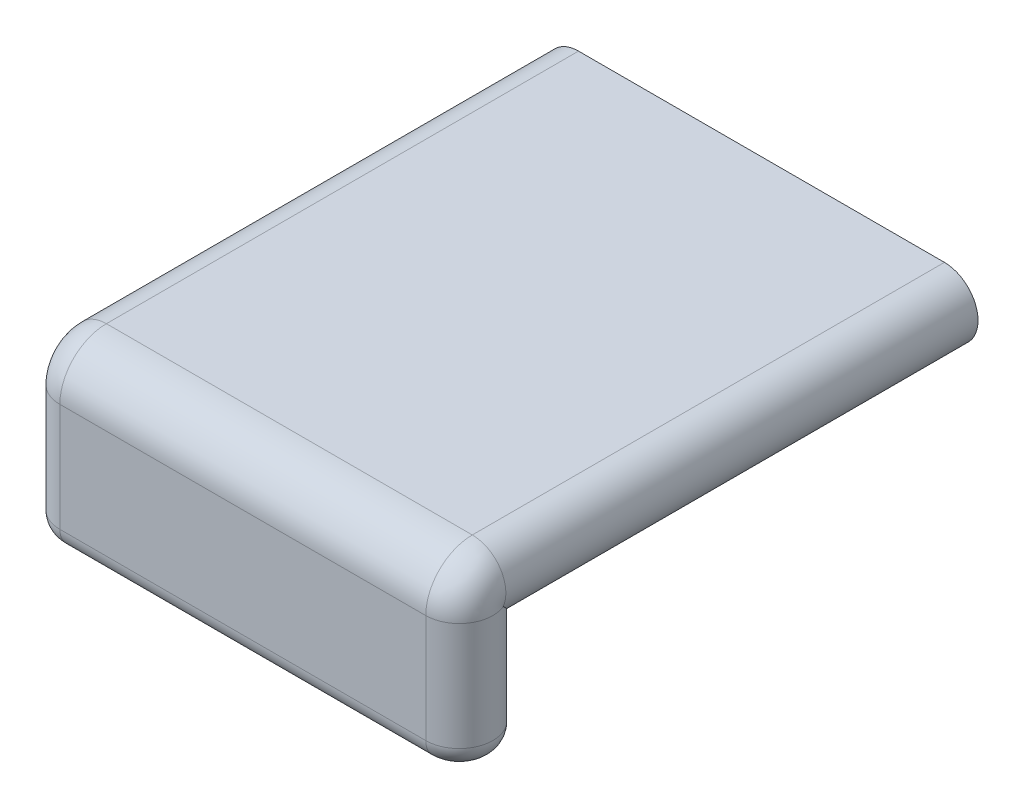
ISO-10303-21;
HEADER;
FILE_DESCRIPTION(('STEP AP214'),'2;1');
FILE_NAME('part.step','',(''),(''),'','','');
FILE_SCHEMA(('AUTOMOTIVE_DESIGN { 1 0 10303 214 1 1 1 1 }'));
ENDSEC;
DATA;
#1=APPLICATION_CONTEXT('core data for automotive mechanical design processes');
#2=APPLICATION_PROTOCOL_DEFINITION('international standard','automotive_design',2000,#1);
#3=PRODUCT_CONTEXT('',#1,'mechanical');
#4=PRODUCT('Part','Part','',(#3));
#5=PRODUCT_RELATED_PRODUCT_CATEGORY('part','',(#4));
#6=PRODUCT_DEFINITION_FORMATION('','',#4);
#7=PRODUCT_DEFINITION_CONTEXT('part definition',#1,'design');
#8=PRODUCT_DEFINITION('design','',#6,#7);
#9=PRODUCT_DEFINITION_SHAPE('','',#8);
#10=(LENGTH_UNIT() NAMED_UNIT(*) SI_UNIT(.MILLI.,.METRE.));
#11=(NAMED_UNIT(*) PLANE_ANGLE_UNIT() SI_UNIT($,.RADIAN.));
#12=(NAMED_UNIT(*) SI_UNIT($,.STERADIAN.) SOLID_ANGLE_UNIT());
#13=UNCERTAINTY_MEASURE_WITH_UNIT(LENGTH_MEASURE(1.E-05),#10,'distance_accuracy_value','');
#14=(GEOMETRIC_REPRESENTATION_CONTEXT(3) GLOBAL_UNCERTAINTY_ASSIGNED_CONTEXT((#13)) GLOBAL_UNIT_ASSIGNED_CONTEXT((#10,
#11,#12)) REPRESENTATION_CONTEXT('',''));
#15=CARTESIAN_POINT('',(0.,0.,0.));
#16=DIRECTION('',(0.,0.,1.));
#17=DIRECTION('',(1.,0.,0.));
#18=AXIS2_PLACEMENT_3D('',#15,#16,#17);
#19=CARTESIAN_POINT('',(-4.225,0.,10.9032));
#20=DIRECTION('',(0.,0.,-1.));
#21=DIRECTION('',(-1.,0.,0.));
#22=AXIS2_PLACEMENT_3D('',#19,#20,#21);
#23=CYLINDRICAL_SURFACE('',#22,0.775);
#24=DIRECTION('',(0.,0.,-1.));
#25=VECTOR('',#24,1.);
#26=CARTESIAN_POINT('',(-4.225,-0.775000000000014,10.9032));
#27=LINE('',#26,#25);
#28=CARTESIAN_POINT('',(-4.22499999999997,-0.775000000000014,10.4282));
#29=VERTEX_POINT('',#28);
#30=CARTESIAN_POINT('',(-4.225,-0.775,0.));
#31=VERTEX_POINT('',#30);
#32=EDGE_CURVE('E217',#29,#31,#27,.T.);
#33=ORIENTED_EDGE('',*,*,#32,.F.);
#34=CARTESIAN_POINT('',(-4.225,0.,11.2032));
#35=DIRECTION('',(0.,0.707106781186547,-0.707106781186547));
#36=DIRECTION('',(0.,-0.707106781186547,-0.707106781186547));
#37=AXIS2_PLACEMENT_3D('',#34,#35,#36);
#38=ELLIPSE('',#37,1.09601551083915,0.775);
#39=CARTESIAN_POINT('',(-4.9395802963978,-0.299999999999993,10.9032));
#40=VERTEX_POINT('',#39);
#41=EDGE_CURVE('E575',#29,#40,#38,.T.);
#42=ORIENTED_EDGE('',*,*,#41,.T.);
#43=CARTESIAN_POINT('',(-4.225,0.,10.9032));
#44=DIRECTION('',(0.,0.,1.));
#45=DIRECTION('',(1.,0.,0.));
#46=AXIS2_PLACEMENT_3D('',#43,#44,#45);
#47=CIRCLE('',#46,0.775);
#48=CARTESIAN_POINT('',(-4.22499999999997,0.774999999999987,10.9032));
#49=VERTEX_POINT('',#48);
#50=EDGE_CURVE('E198',#49,#40,#47,.T.);
#51=ORIENTED_EDGE('',*,*,#50,.F.);
#52=DIRECTION('',(0.,0.,-1.));
#53=VECTOR('',#52,1.);
#54=CARTESIAN_POINT('',(-4.22499999999997,0.774999999999987,10.9032));
#55=LINE('',#54,#53);
#56=CARTESIAN_POINT('',(-4.22499999999997,0.775,-1.11022302462516E-13));
#57=VERTEX_POINT('',#56);
#58=EDGE_CURVE('E193',#49,#57,#55,.T.);
#59=ORIENTED_EDGE('',*,*,#58,.T.);
#60=CARTESIAN_POINT('',(-4.225,0.,0.));
#61=DIRECTION('',(0.,0.,1.));
#62=DIRECTION('',(1.,0.,0.));
#63=AXIS2_PLACEMENT_3D('',#60,#61,#62);
#64=CIRCLE('',#63,0.775);
#65=EDGE_CURVE('E207',#57,#31,#64,.T.);
#66=ORIENTED_EDGE('',*,*,#65,.T.);
#67=EDGE_LOOP('',(#33,#42,#51,#59,#66));
#68=FACE_BOUND('',#67,.T.);
#69=ADVANCED_FACE('F34',(#68),#23,.T.);
#70=CARTESIAN_POINT('',(-4.225,-0.775000000000014,10.9032));
#71=DIRECTION('',(0.,1.,0.));
#72=DIRECTION('',(0.,0.,1.));
#73=AXIS2_PLACEMENT_3D('',#70,#71,#72);
#74=PLANE('',#73);
#75=DIRECTION('',(0.,0.,-1.));
#76=VECTOR('',#75,1.);
#77=CARTESIAN_POINT('',(4.225,-0.775000000000014,10.9032));
#78=LINE('',#77,#76);
#79=CARTESIAN_POINT('',(4.22500000000003,-0.775000000000014,10.4282));
#80=VERTEX_POINT('',#79);
#81=CARTESIAN_POINT('',(4.225,-0.775,1.11022302462516E-13));
#82=VERTEX_POINT('',#81);
#83=EDGE_CURVE('E192',#80,#82,#78,.T.);
#84=ORIENTED_EDGE('',*,*,#83,.F.);
#85=DIRECTION('',(-1.,0.,0.));
#86=VECTOR('',#85,1.);
#87=CARTESIAN_POINT('',(-4.22499999999997,-0.775000000000014,10.4282));
#88=LINE('',#87,#86);
#89=EDGE_CURVE('E369',#80,#29,#88,.T.);
#90=ORIENTED_EDGE('',*,*,#89,.T.);
#91=ORIENTED_EDGE('',*,*,#32,.T.);
#92=DIRECTION('',(1.,0.,0.));
#93=VECTOR('',#92,1.);
#94=CARTESIAN_POINT('',(-4.225,-0.775,0.));
#95=LINE('',#94,#93);
#96=EDGE_CURVE('E210',#31,#82,#95,.T.);
#97=ORIENTED_EDGE('',*,*,#96,.T.);
#98=EDGE_LOOP('',(#84,#90,#91,#97));
#99=FACE_BOUND('',#98,.T.);
#100=ADVANCED_FACE('F322',(#99),#74,.F.);
#101=CARTESIAN_POINT('',(4.225,0.,10.9032000000002));
#102=DIRECTION('',(0.,0.,-1.));
#103=DIRECTION('',(-1.,0.,0.));
#104=AXIS2_PLACEMENT_3D('',#101,#102,#103);
#105=CYLINDRICAL_SURFACE('',#104,0.775);
#106=CARTESIAN_POINT('',(4.225,0.,10.9032000000002));
#107=DIRECTION('',(0.,0.,1.));
#108=DIRECTION('',(1.,0.,0.));
#109=AXIS2_PLACEMENT_3D('',#106,#107,#108);
#110=CIRCLE('',#109,0.775);
#111=CARTESIAN_POINT('',(4.93958029639785,-0.300000000000014,10.9032));
#112=VERTEX_POINT('',#111);
#113=CARTESIAN_POINT('',(4.22500000000003,0.774999999999987,10.9032));
#114=VERTEX_POINT('',#113);
#115=EDGE_CURVE('E162',#112,#114,#110,.T.);
#116=ORIENTED_EDGE('',*,*,#115,.F.);
#117=CARTESIAN_POINT('',(4.225,0.,11.2032000000002));
#118=DIRECTION('',(0.,0.707106781186547,-0.707106781186547));
#119=DIRECTION('',(0.,-0.707106781186547,-0.707106781186547));
#120=AXIS2_PLACEMENT_3D('',#117,#118,#119);
#121=ELLIPSE('',#120,1.09601551083915,0.775);
#122=EDGE_CURVE('E374',#112,#80,#121,.T.);
#123=ORIENTED_EDGE('',*,*,#122,.T.);
#124=ORIENTED_EDGE('',*,*,#83,.T.);
#125=CARTESIAN_POINT('',(4.225,0.,0.));
#126=DIRECTION('',(0.,0.,1.));
#127=DIRECTION('',(1.,0.,0.));
#128=AXIS2_PLACEMENT_3D('',#125,#126,#127);
#129=CIRCLE('',#128,0.775);
#130=CARTESIAN_POINT('',(4.22500000000003,0.775,0.));
#131=VERTEX_POINT('',#130);
#132=EDGE_CURVE('E189',#82,#131,#129,.T.);
#133=ORIENTED_EDGE('',*,*,#132,.T.);
#134=DIRECTION('',(0.,0.,-1.));
#135=VECTOR('',#134,1.);
#136=CARTESIAN_POINT('',(4.22500000000003,0.774999999999987,10.9032));
#137=LINE('',#136,#135);
#138=EDGE_CURVE('E186',#114,#131,#137,.T.);
#139=ORIENTED_EDGE('',*,*,#138,.F.);
#140=EDGE_LOOP('',(#116,#123,#124,#133,#139));
#141=FACE_BOUND('',#140,.T.);
#142=ADVANCED_FACE('F187',(#141),#105,.T.);
#143=CARTESIAN_POINT('',(-4.22499999999997,0.774999999999987,10.9032));
#144=DIRECTION('',(0.,-1.,0.));
#145=DIRECTION('',(0.,0.,-1.));
#146=AXIS2_PLACEMENT_3D('',#143,#144,#145);
#147=PLANE('',#146);
#148=DIRECTION('',(-1.,0.,0.));
#149=VECTOR('',#148,1.);
#150=CARTESIAN_POINT('',(-4.22499999999997,0.775,-1.11022302462516E-13));
#151=LINE('',#150,#149);
#152=EDGE_CURVE('E201',#131,#57,#151,.T.);
#153=ORIENTED_EDGE('',*,*,#152,.T.);
#154=ORIENTED_EDGE('',*,*,#58,.F.);
#155=DIRECTION('',(-1.,0.,0.));
#156=VECTOR('',#155,1.);
#157=CARTESIAN_POINT('',(-4.22499999999997,0.774999999999987,10.9032));
#158=LINE('',#157,#156);
#159=EDGE_CURVE('E178',#114,#49,#158,.T.);
#160=ORIENTED_EDGE('',*,*,#159,.F.);
#161=ORIENTED_EDGE('',*,*,#138,.T.);
#162=EDGE_LOOP('',(#153,#154,#160,#161));
#163=FACE_BOUND('',#162,.T.);
#164=ADVANCED_FACE('F195',(#163),#147,.F.);
#165=CARTESIAN_POINT('',(-4.225,0.,0.));
#166=DIRECTION('',(0.,0.,1.));
#167=DIRECTION('',(1.,0.,0.));
#168=AXIS2_PLACEMENT_3D('',#165,#166,#167);
#169=PLANE('',#168);
#170=DIRECTION('',(0.,-1.,0.));
#171=VECTOR('',#170,1.);
#172=CARTESIAN_POINT('',(-4.49999999999997,-0.25,0.));
#173=LINE('',#172,#171);
#174=CARTESIAN_POINT('',(-4.5,0.0499999999999997,0.));
#175=VERTEX_POINT('',#174);
#176=CARTESIAN_POINT('',(-4.5,-0.0500000000000014,0.));
#177=VERTEX_POINT('',#176);
#178=EDGE_CURVE('E390',#175,#177,#173,.T.);
#179=ORIENTED_EDGE('',*,*,#178,.T.);
#180=CARTESIAN_POINT('',(-4.3,-0.0499999999999997,0.));
#181=DIRECTION('',(0.,0.,1.));
#182=DIRECTION('',(1.,0.,0.));
#183=AXIS2_PLACEMENT_3D('',#180,#181,#182);
#184=CIRCLE('',#183,0.2);
#185=CARTESIAN_POINT('',(-4.29999999999997,-0.25,0.));
#186=VERTEX_POINT('',#185);
#187=EDGE_CURVE('E257',#177,#186,#184,.T.);
#188=ORIENTED_EDGE('',*,*,#187,.T.);
#189=DIRECTION('',(1.,0.,0.));
#190=VECTOR('',#189,1.);
#191=CARTESIAN_POINT('',(-4.49999999999997,-0.25,0.));
#192=LINE('',#191,#190);
#193=CARTESIAN_POINT('',(4.30000000000003,-0.25,0.));
#194=VERTEX_POINT('',#193);
#195=EDGE_CURVE('E211',#186,#194,#192,.T.);
#196=ORIENTED_EDGE('',*,*,#195,.T.);
#197=CARTESIAN_POINT('',(4.3,-0.0499999999999997,0.));
#198=DIRECTION('',(0.,0.,1.));
#199=DIRECTION('',(1.,0.,0.));
#200=AXIS2_PLACEMENT_3D('',#197,#198,#199);
#201=CIRCLE('',#200,0.2);
#202=CARTESIAN_POINT('',(4.5,-0.0500000000000136,0.));
#203=VERTEX_POINT('',#202);
#204=EDGE_CURVE('E242',#194,#203,#201,.T.);
#205=ORIENTED_EDGE('',*,*,#204,.T.);
#206=DIRECTION('',(0.,1.,0.));
#207=VECTOR('',#206,1.);
#208=CARTESIAN_POINT('',(4.50000000000003,-0.250000000000002,0.));
#209=LINE('',#208,#207);
#210=CARTESIAN_POINT('',(4.5,0.0499999999999876,0.));
#211=VERTEX_POINT('',#210);
#212=EDGE_CURVE('E380',#203,#211,#209,.T.);
#213=ORIENTED_EDGE('',*,*,#212,.T.);
#214=CARTESIAN_POINT('',(4.3,0.0499999999999997,0.));
#215=DIRECTION('',(0.,0.,1.));
#216=DIRECTION('',(1.,0.,0.));
#217=AXIS2_PLACEMENT_3D('',#214,#215,#216);
#218=CIRCLE('',#217,0.2);
#219=CARTESIAN_POINT('',(4.3,0.25,0.));
#220=VERTEX_POINT('',#219);
#221=EDGE_CURVE('E247',#211,#220,#218,.T.);
#222=ORIENTED_EDGE('',*,*,#221,.T.);
#223=DIRECTION('',(-1.,0.,0.));
#224=VECTOR('',#223,1.);
#225=CARTESIAN_POINT('',(-4.5,0.249999999999997,0.));
#226=LINE('',#225,#224);
#227=CARTESIAN_POINT('',(-4.3,0.25,0.));
#228=VERTEX_POINT('',#227);
#229=EDGE_CURVE('E384',#220,#228,#226,.T.);
#230=ORIENTED_EDGE('',*,*,#229,.T.);
#231=CARTESIAN_POINT('',(-4.3,0.0499999999999997,0.));
#232=DIRECTION('',(0.,0.,1.));
#233=DIRECTION('',(1.,0.,0.));
#234=AXIS2_PLACEMENT_3D('',#231,#232,#233);
#235=CIRCLE('',#234,0.2);
#236=EDGE_CURVE('E252',#228,#175,#235,.T.);
#237=ORIENTED_EDGE('',*,*,#236,.T.);
#238=EDGE_LOOP('',(#179,#188,#196,#205,#213,#222,#230,#237));
#239=FACE_BOUND('',#238,.T.);
#240=ORIENTED_EDGE('',*,*,#65,.F.);
#241=ORIENTED_EDGE('',*,*,#152,.F.);
#242=ORIENTED_EDGE('',*,*,#132,.F.);
#243=ORIENTED_EDGE('',*,*,#96,.F.);
#244=EDGE_LOOP('',(#240,#241,#242,#243));
#245=FACE_BOUND('',#244,.T.);
#246=ADVANCED_FACE('F399',(#239,#245),#169,.F.);
#247=CARTESIAN_POINT('',(4.50000000000003,-0.250000000000002,0.));
#248=DIRECTION('',(1.,0.,0.));
#249=DIRECTION('',(0.,0.,-1.));
#250=AXIS2_PLACEMENT_3D('',#247,#248,#249);
#251=PLANE('',#250);
#252=ORIENTED_EDGE('',*,*,#212,.F.);
#253=DIRECTION('',(0.,0.,1.));
#254=VECTOR('',#253,1.);
#255=CARTESIAN_POINT('',(4.5,-0.0500000000000136,10.9032000000002));
#256=LINE('',#255,#254);
#257=CARTESIAN_POINT('',(4.5,-0.0500000000000136,10.9032000000002));
#258=VERTEX_POINT('',#257);
#259=EDGE_CURVE('E221',#203,#258,#256,.T.);
#260=ORIENTED_EDGE('',*,*,#259,.T.);
#261=DIRECTION('',(0.,1.,0.));
#262=VECTOR('',#261,1.);
#263=CARTESIAN_POINT('',(4.50000000000003,-0.250000000000014,10.9032));
#264=LINE('',#263,#262);
#265=CARTESIAN_POINT('',(4.5,0.0499999999999858,10.9032));
#266=VERTEX_POINT('',#265);
#267=EDGE_CURVE('E364',#258,#266,#264,.T.);
#268=ORIENTED_EDGE('',*,*,#267,.T.);
#269=DIRECTION('',(0.,0.,1.));
#270=VECTOR('',#269,1.);
#271=CARTESIAN_POINT('',(4.5,0.0499999999999876,0.));
#272=LINE('',#271,#270);
#273=EDGE_CURVE('E219',#266,#211,#272,.F.);
#274=ORIENTED_EDGE('',*,*,#273,.T.);
#275=EDGE_LOOP('',(#252,#260,#268,#274));
#276=FACE_BOUND('',#275,.T.);
#277=ADVANCED_FACE('F403',(#276),#251,.F.);
#278=CARTESIAN_POINT('',(-4.49999999999997,-0.25,0.));
#279=DIRECTION('',(0.,-1.,0.));
#280=DIRECTION('',(0.,0.,-1.));
#281=AXIS2_PLACEMENT_3D('',#278,#279,#280);
#282=PLANE('',#281);
#283=DIRECTION('',(1.,0.,0.));
#284=VECTOR('',#283,1.);
#285=CARTESIAN_POINT('',(-4.49999999999997,-0.250000000000014,10.9032));
#286=LINE('',#285,#284);
#287=CARTESIAN_POINT('',(-4.29999999999997,-0.250000000000012,10.9032));
#288=VERTEX_POINT('',#287);
#289=CARTESIAN_POINT('',(4.30000000000003,-0.250000000000014,10.9032));
#290=VERTEX_POINT('',#289);
#291=EDGE_CURVE('E379',#288,#290,#286,.T.);
#292=ORIENTED_EDGE('',*,*,#291,.T.);
#293=DIRECTION('',(0.,0.,1.));
#294=VECTOR('',#293,1.);
#295=CARTESIAN_POINT('',(4.30000000000003,-0.25,0.));
#296=LINE('',#295,#294);
#297=EDGE_CURVE('E227',#290,#194,#296,.F.);
#298=ORIENTED_EDGE('',*,*,#297,.T.);
#299=ORIENTED_EDGE('',*,*,#195,.F.);
#300=DIRECTION('',(0.,0.,1.));
#301=VECTOR('',#300,1.);
#302=CARTESIAN_POINT('',(-4.29999999999997,-0.250000000000012,10.9032));
#303=LINE('',#302,#301);
#304=EDGE_CURVE('E224',#186,#288,#303,.T.);
#305=ORIENTED_EDGE('',*,*,#304,.T.);
#306=EDGE_LOOP('',(#292,#298,#299,#305));
#307=FACE_BOUND('',#306,.T.);
#308=ADVANCED_FACE('F414',(#307),#282,.F.);
#309=CARTESIAN_POINT('',(-4.49999999999997,-0.25,0.));
#310=DIRECTION('',(-1.,0.,0.));
#311=DIRECTION('',(0.,0.,1.));
#312=AXIS2_PLACEMENT_3D('',#309,#310,#311);
#313=PLANE('',#312);
#314=ORIENTED_EDGE('',*,*,#178,.F.);
#315=DIRECTION('',(0.,0.,1.));
#316=VECTOR('',#315,1.);
#317=CARTESIAN_POINT('',(-4.5,0.0499999999999858,10.9032));
#318=LINE('',#317,#316);
#319=CARTESIAN_POINT('',(-4.5,0.0499999999999858,10.9032));
#320=VERTEX_POINT('',#319);
#321=EDGE_CURVE('E236',#175,#320,#318,.T.);
#322=ORIENTED_EDGE('',*,*,#321,.T.);
#323=DIRECTION('',(0.,-1.,0.));
#324=VECTOR('',#323,1.);
#325=CARTESIAN_POINT('',(-4.49999999999997,-0.250000000000014,10.9032));
#326=LINE('',#325,#324);
#327=CARTESIAN_POINT('',(-4.5,-0.0500000000000136,10.9032));
#328=VERTEX_POINT('',#327);
#329=EDGE_CURVE('E371',#320,#328,#326,.T.);
#330=ORIENTED_EDGE('',*,*,#329,.T.);
#331=DIRECTION('',(0.,0.,1.));
#332=VECTOR('',#331,1.);
#333=CARTESIAN_POINT('',(-4.5,-0.0500000000000014,0.));
#334=LINE('',#333,#332);
#335=EDGE_CURVE('E234',#328,#177,#334,.F.);
#336=ORIENTED_EDGE('',*,*,#335,.T.);
#337=EDGE_LOOP('',(#314,#322,#330,#336));
#338=FACE_BOUND('',#337,.T.);
#339=ADVANCED_FACE('F413',(#338),#313,.F.);
#340=CARTESIAN_POINT('',(-4.5,0.249999999999997,0.));
#341=DIRECTION('',(0.,1.,0.));
#342=DIRECTION('',(0.,0.,1.));
#343=AXIS2_PLACEMENT_3D('',#340,#341,#342);
#344=PLANE('',#343);
#345=ORIENTED_EDGE('',*,*,#229,.F.);
#346=DIRECTION('',(0.,0.,1.));
#347=VECTOR('',#346,1.);
#348=CARTESIAN_POINT('',(4.3,0.249999999999986,10.9032));
#349=LINE('',#348,#347);
#350=CARTESIAN_POINT('',(4.3,0.249999999999986,10.9032));
#351=VERTEX_POINT('',#350);
#352=EDGE_CURVE('E231',#220,#351,#349,.T.);
#353=ORIENTED_EDGE('',*,*,#352,.T.);
#354=DIRECTION('',(-1.,0.,0.));
#355=VECTOR('',#354,1.);
#356=CARTESIAN_POINT('',(-4.5,0.249999999999986,10.9032));
#357=LINE('',#356,#355);
#358=CARTESIAN_POINT('',(-4.29999999999999,0.249999999999986,10.9032));
#359=VERTEX_POINT('',#358);
#360=EDGE_CURVE('E368',#351,#359,#357,.T.);
#361=ORIENTED_EDGE('',*,*,#360,.T.);
#362=DIRECTION('',(0.,0.,1.));
#363=VECTOR('',#362,1.);
#364=CARTESIAN_POINT('',(-4.3,0.25,0.));
#365=LINE('',#364,#363);
#366=EDGE_CURVE('E229',#359,#228,#365,.F.);
#367=ORIENTED_EDGE('',*,*,#366,.T.);
#368=EDGE_LOOP('',(#345,#353,#361,#367));
#369=FACE_BOUND('',#368,.T.);
#370=ADVANCED_FACE('F337',(#369),#344,.F.);
#371=CARTESIAN_POINT('',(4.3,-0.0499999999999997,0.));
#372=DIRECTION('',(0.,0.,-1.));
#373=DIRECTION('',(-1.,0.,0.));
#374=AXIS2_PLACEMENT_3D('',#371,#372,#373);
#375=CYLINDRICAL_SURFACE('',#374,0.2);
#376=ORIENTED_EDGE('',*,*,#204,.F.);
#377=ORIENTED_EDGE('',*,*,#297,.F.);
#378=CARTESIAN_POINT('',(4.3,-0.0500000000000136,10.9032000000002));
#379=DIRECTION('',(0.,0.,1.));
#380=DIRECTION('',(1.,0.,0.));
#381=AXIS2_PLACEMENT_3D('',#378,#379,#380);
#382=CIRCLE('',#381,0.2);
#383=EDGE_CURVE('E239',#258,#290,#382,.F.);
#384=ORIENTED_EDGE('',*,*,#383,.F.);
#385=ORIENTED_EDGE('',*,*,#259,.F.);
#386=EDGE_LOOP('',(#376,#377,#384,#385));
#387=FACE_BOUND('',#386,.T.);
#388=ADVANCED_FACE('F333',(#387),#375,.F.);
#389=CARTESIAN_POINT('',(4.3,0.0499999999999997,0.));
#390=DIRECTION('',(0.,0.,-1.));
#391=DIRECTION('',(-1.,0.,0.));
#392=AXIS2_PLACEMENT_3D('',#389,#390,#391);
#393=CYLINDRICAL_SURFACE('',#392,0.2);
#394=ORIENTED_EDGE('',*,*,#221,.F.);
#395=ORIENTED_EDGE('',*,*,#273,.F.);
#396=CARTESIAN_POINT('',(4.3,0.0499999999999858,10.9032000000002));
#397=DIRECTION('',(0.,0.,1.));
#398=DIRECTION('',(1.,0.,0.));
#399=AXIS2_PLACEMENT_3D('',#396,#397,#398);
#400=CIRCLE('',#399,0.2);
#401=EDGE_CURVE('E244',#351,#266,#400,.F.);
#402=ORIENTED_EDGE('',*,*,#401,.F.);
#403=ORIENTED_EDGE('',*,*,#352,.F.);
#404=EDGE_LOOP('',(#394,#395,#402,#403));
#405=FACE_BOUND('',#404,.T.);
#406=ADVANCED_FACE('F336',(#405),#393,.F.);
#407=CARTESIAN_POINT('',(-4.3,0.0499999999999997,0.));
#408=DIRECTION('',(0.,0.,-1.));
#409=DIRECTION('',(-1.,0.,0.));
#410=AXIS2_PLACEMENT_3D('',#407,#408,#409);
#411=CYLINDRICAL_SURFACE('',#410,0.2);
#412=ORIENTED_EDGE('',*,*,#236,.F.);
#413=ORIENTED_EDGE('',*,*,#366,.F.);
#414=CARTESIAN_POINT('',(-4.3,0.0499999999999876,10.9032));
#415=DIRECTION('',(0.,0.,1.));
#416=DIRECTION('',(1.,0.,0.));
#417=AXIS2_PLACEMENT_3D('',#414,#415,#416);
#418=CIRCLE('',#417,0.2);
#419=EDGE_CURVE('E249',#320,#359,#418,.F.);
#420=ORIENTED_EDGE('',*,*,#419,.F.);
#421=ORIENTED_EDGE('',*,*,#321,.F.);
#422=EDGE_LOOP('',(#412,#413,#420,#421));
#423=FACE_BOUND('',#422,.T.);
#424=ADVANCED_FACE('F316',(#423),#411,.F.);
#425=CARTESIAN_POINT('',(-4.3,-0.0499999999999997,0.));
#426=DIRECTION('',(0.,0.,-1.));
#427=DIRECTION('',(-1.,0.,0.));
#428=AXIS2_PLACEMENT_3D('',#425,#426,#427);
#429=CYLINDRICAL_SURFACE('',#428,0.2);
#430=ORIENTED_EDGE('',*,*,#187,.F.);
#431=ORIENTED_EDGE('',*,*,#335,.F.);
#432=CARTESIAN_POINT('',(-4.3,-0.0500000000000136,10.9032));
#433=DIRECTION('',(0.,0.,1.));
#434=DIRECTION('',(1.,0.,0.));
#435=AXIS2_PLACEMENT_3D('',#432,#433,#434);
#436=CIRCLE('',#435,0.2);
#437=EDGE_CURVE('E254',#288,#328,#436,.F.);
#438=ORIENTED_EDGE('',*,*,#437,.F.);
#439=ORIENTED_EDGE('',*,*,#304,.F.);
#440=EDGE_LOOP('',(#430,#431,#438,#439));
#441=FACE_BOUND('',#440,.T.);
#442=ADVANCED_FACE('F309',(#441),#429,.F.);
#443=CARTESIAN_POINT('',(-4.225,-3.3,11.2032));
#444=DIRECTION('',(0.,-1.,0.));
#445=DIRECTION('',(1.,0.,0.));
#446=AXIS2_PLACEMENT_3D('',#443,#444,#445);
#447=PLANE('',#446);
#448=CARTESIAN_POINT('',(4.225,-3.3,11.2032));
#449=DIRECTION('',(0.,-1.,0.));
#450=DIRECTION('',(0.,0.,-1.));
#451=AXIS2_PLACEMENT_3D('',#448,#449,#450);
#452=CIRCLE('',#451,0.275);
#453=CARTESIAN_POINT('',(4.22500000000003,-3.30000000000001,10.9282));
#454=VERTEX_POINT('',#453);
#455=CARTESIAN_POINT('',(4.225,-3.3,11.4782));
#456=VERTEX_POINT('',#455);
#457=EDGE_CURVE('E263',#454,#456,#452,.T.);
#458=ORIENTED_EDGE('',*,*,#457,.T.);
#459=DIRECTION('',(-1.,0.,0.));
#460=VECTOR('',#459,1.);
#461=CARTESIAN_POINT('',(-4.225,-3.3,11.4782));
#462=LINE('',#461,#460);
#463=CARTESIAN_POINT('',(-4.225,-3.3,11.4782));
#464=VERTEX_POINT('',#463);
#465=EDGE_CURVE('E265',#456,#464,#462,.T.);
#466=ORIENTED_EDGE('',*,*,#465,.T.);
#467=CARTESIAN_POINT('',(-4.225,-3.3,11.2032));
#468=DIRECTION('',(0.,-1.,0.));
#469=DIRECTION('',(0.,0.,-1.));
#470=AXIS2_PLACEMENT_3D('',#467,#468,#469);
#471=CIRCLE('',#470,0.275);
#472=CARTESIAN_POINT('',(-4.22499999999997,-3.30000000000001,10.9282));
#473=VERTEX_POINT('',#472);
#474=EDGE_CURVE('E258',#464,#473,#471,.T.);
#475=ORIENTED_EDGE('',*,*,#474,.T.);
#476=DIRECTION('',(1.,0.,0.));
#477=VECTOR('',#476,1.);
#478=CARTESIAN_POINT('',(-4.22499999999997,-3.30000000000001,10.9282));
#479=LINE('',#478,#477);
#480=EDGE_CURVE('E261',#473,#454,#479,.T.);
#481=ORIENTED_EDGE('',*,*,#480,.T.);
#482=EDGE_LOOP('',(#458,#466,#475,#481));
#483=FACE_BOUND('',#482,.T.);
#484=ADVANCED_FACE('F307',(#483),#447,.T.);
#485=CARTESIAN_POINT('',(4.22500000000003,-0.299999999999983,11.9782));
#486=DIRECTION('',(0.,0.,1.));
#487=DIRECTION('',(1.,0.,0.));
#488=AXIS2_PLACEMENT_3D('',#485,#486,#487);
#489=PLANE('',#488);
#490=DIRECTION('',(0.,-1.,0.));
#491=VECTOR('',#490,1.);
#492=CARTESIAN_POINT('',(-4.22499999999997,-0.299999999999983,11.9782));
#493=LINE('',#492,#491);
#494=CARTESIAN_POINT('',(-4.22499999999997,-0.299999999999983,11.9782));
#495=VERTEX_POINT('',#494);
#496=CARTESIAN_POINT('',(-4.225,-2.8,11.9782));
#497=VERTEX_POINT('',#496);
#498=EDGE_CURVE('E182',#495,#497,#493,.T.);
#499=ORIENTED_EDGE('',*,*,#498,.T.);
#500=DIRECTION('',(-1.,0.,0.));
#501=VECTOR('',#500,1.);
#502=CARTESIAN_POINT('',(4.225,-2.8,11.9782));
#503=LINE('',#502,#501);
#504=CARTESIAN_POINT('',(4.225,-2.79999999999997,11.9782));
#505=VERTEX_POINT('',#504);
#506=EDGE_CURVE('E268',#497,#505,#503,.F.);
#507=ORIENTED_EDGE('',*,*,#506,.T.);
#508=DIRECTION('',(0.,-1.,0.));
#509=VECTOR('',#508,1.);
#510=CARTESIAN_POINT('',(4.22500000000003,-0.299999999999983,11.9782));
#511=LINE('',#510,#509);
#512=CARTESIAN_POINT('',(4.22500000000003,-0.299999999999983,11.9782));
#513=VERTEX_POINT('',#512);
#514=EDGE_CURVE('E301',#513,#505,#511,.T.);
#515=ORIENTED_EDGE('',*,*,#514,.F.);
#516=DIRECTION('',(-1.,0.,0.));
#517=VECTOR('',#516,1.);
#518=CARTESIAN_POINT('',(4.22500000000003,-0.299999999999983,11.9782));
#519=LINE('',#518,#517);
#520=EDGE_CURVE('E181',#513,#495,#519,.T.);
#521=ORIENTED_EDGE('',*,*,#520,.T.);
#522=EDGE_LOOP('',(#499,#507,#515,#521));
#523=FACE_BOUND('',#522,.T.);
#524=ADVANCED_FACE('F299',(#523),#489,.T.);
#525=CARTESIAN_POINT('',(0.,-0.300000000000014,10.9032));
#526=DIRECTION('',(-1.,0.,0.));
#527=DIRECTION('',(0.,0.,1.));
#528=AXIS2_PLACEMENT_3D('',#525,#526,#527);
#529=CYLINDRICAL_SURFACE('',#528,1.075);
#530=ORIENTED_EDGE('',*,*,#520,.F.);
#531=CARTESIAN_POINT('',(4.22500000000003,-0.300000000000014,10.9032));
#532=DIRECTION('',(-1.,0.,0.));
#533=DIRECTION('',(0.,0.,1.));
#534=AXIS2_PLACEMENT_3D('',#531,#532,#533);
#535=CIRCLE('',#534,1.075);
#536=EDGE_CURVE('E165',#513,#114,#535,.T.);
#537=ORIENTED_EDGE('',*,*,#536,.T.);
#538=ORIENTED_EDGE('',*,*,#159,.T.);
#539=CARTESIAN_POINT('',(-4.22499999999997,-0.300000000000014,10.9032));
#540=DIRECTION('',(-1.,0.,0.));
#541=DIRECTION('',(0.,0.,1.));
#542=AXIS2_PLACEMENT_3D('',#539,#540,#541);
#543=CIRCLE('',#542,1.075);
#544=EDGE_CURVE('E183',#495,#49,#543,.T.);
#545=ORIENTED_EDGE('',*,*,#544,.F.);
#546=EDGE_LOOP('',(#530,#537,#538,#545));
#547=FACE_BOUND('',#546,.T.);
#548=ADVANCED_FACE('F175',(#547),#529,.T.);
#549=CARTESIAN_POINT('',(4.225,-0.300000000000014,11.2032));
#550=DIRECTION('',(0.,-1.,0.));
#551=DIRECTION('',(0.,0.,-1.));
#552=AXIS2_PLACEMENT_3D('',#549,#550,#551);
#553=CYLINDRICAL_SURFACE('',#552,0.775);
#554=ORIENTED_EDGE('',*,*,#514,.T.);
#555=CARTESIAN_POINT('',(4.225,-2.79999999999999,11.2032));
#556=DIRECTION('',(0.,-1.,0.));
#557=DIRECTION('',(0.,0.,-1.));
#558=AXIS2_PLACEMENT_3D('',#555,#556,#557);
#559=CIRCLE('',#558,0.775);
#560=CARTESIAN_POINT('',(4.225,-2.80000000000001,10.4282));
#561=VERTEX_POINT('',#560);
#562=EDGE_CURVE('E58',#505,#561,#559,.F.);
#563=ORIENTED_EDGE('',*,*,#562,.T.);
#564=DIRECTION('',(0.,-1.,0.));
#565=VECTOR('',#564,1.);
#566=CARTESIAN_POINT('',(4.225,-0.300000000000031,10.4282));
#567=LINE('',#566,#565);
#568=EDGE_CURVE('E573',#80,#561,#567,.T.);
#569=ORIENTED_EDGE('',*,*,#568,.F.);
#570=ORIENTED_EDGE('',*,*,#122,.F.);
#571=CARTESIAN_POINT('',(4.225,-0.300000000000014,11.2032));
#572=DIRECTION('',(0.,-1.,0.));
#573=DIRECTION('',(1.,0.,0.));
#574=AXIS2_PLACEMENT_3D('',#571,#572,#573);
#575=CIRCLE('',#574,0.775);
#576=EDGE_CURVE('E167',#112,#513,#575,.T.);
#577=ORIENTED_EDGE('',*,*,#576,.T.);
#578=EDGE_LOOP('',(#554,#563,#569,#570,#577));
#579=FACE_BOUND('',#578,.T.);
#580=ADVANCED_FACE('F508',(#579),#553,.T.);
#581=CARTESIAN_POINT('',(-4.225,-0.300000000000031,10.4282));
#582=DIRECTION('',(0.,0.,-1.));
#583=DIRECTION('',(-1.,0.,0.));
#584=AXIS2_PLACEMENT_3D('',#581,#582,#583);
#585=PLANE('',#584);
#586=ORIENTED_EDGE('',*,*,#568,.T.);
#587=DIRECTION('',(1.,0.,0.));
#588=VECTOR('',#587,1.);
#589=CARTESIAN_POINT('',(-4.225,-2.80000000000001,10.4282));
#590=LINE('',#589,#588);
#591=CARTESIAN_POINT('',(-4.225,-2.80000000000003,10.4282));
#592=VERTEX_POINT('',#591);
#593=EDGE_CURVE('E43',#561,#592,#590,.F.);
#594=ORIENTED_EDGE('',*,*,#593,.T.);
#595=DIRECTION('',(0.,-1.,0.));
#596=VECTOR('',#595,1.);
#597=CARTESIAN_POINT('',(-4.225,-0.300000000000031,10.4282));
#598=LINE('',#597,#596);
#599=EDGE_CURVE('E296',#29,#592,#598,.T.);
#600=ORIENTED_EDGE('',*,*,#599,.F.);
#601=ORIENTED_EDGE('',*,*,#89,.F.);
#602=EDGE_LOOP('',(#586,#594,#600,#601));
#603=FACE_BOUND('',#602,.T.);
#604=ADVANCED_FACE('F424',(#603),#585,.T.);
#605=CARTESIAN_POINT('',(-4.225,-0.300000000000014,11.2031999999999));
#606=DIRECTION('',(0.,-1.,0.));
#607=DIRECTION('',(0.,0.,-1.));
#608=AXIS2_PLACEMENT_3D('',#605,#606,#607);
#609=CYLINDRICAL_SURFACE('',#608,0.775);
#610=ORIENTED_EDGE('',*,*,#599,.T.);
#611=CARTESIAN_POINT('',(-4.225,-2.80000000000001,11.2032));
#612=DIRECTION('',(0.,-1.,0.));
#613=DIRECTION('',(0.,0.,-1.));
#614=AXIS2_PLACEMENT_3D('',#611,#612,#613);
#615=CIRCLE('',#614,0.775);
#616=EDGE_CURVE('E11',#592,#497,#615,.F.);
#617=ORIENTED_EDGE('',*,*,#616,.T.);
#618=ORIENTED_EDGE('',*,*,#498,.F.);
#619=CARTESIAN_POINT('',(-4.225,-0.300000000000014,11.2031999999999));
#620=DIRECTION('',(0.,-1.,0.));
#621=DIRECTION('',(1.,0.,0.));
#622=AXIS2_PLACEMENT_3D('',#619,#620,#621);
#623=CIRCLE('',#622,0.775);
#624=EDGE_CURVE('E171',#495,#40,#623,.T.);
#625=ORIENTED_EDGE('',*,*,#624,.T.);
#626=ORIENTED_EDGE('',*,*,#41,.F.);
#627=EDGE_LOOP('',(#610,#617,#618,#625,#626));
#628=FACE_BOUND('',#627,.T.);
#629=ADVANCED_FACE('F294',(#628),#609,.T.);
#630=CARTESIAN_POINT('',(4.22500000000003,-0.300000000000014,11.2032));
#631=DIRECTION('',(0.,-1.,0.));
#632=DIRECTION('',(0.,0.,1.));
#633=AXIS2_PLACEMENT_3D('',#630,#631,#632);
#634=CIRCLE('',#633,0.775);
#635=TRIMMED_CURVE('',#634,(PARAMETER_VALUE(-1.96827712894473)),
(PARAMETER_VALUE(1.96827712894473)),.T.,.PARAMETER.);
#636=CARTESIAN_POINT('',(4.22500000000003,-0.300000000000014,10.9032));
#637=DIRECTION('',(-1.,0.,0.));
#638=AXIS1_PLACEMENT('',#636,#637);
#639=SURFACE_OF_REVOLUTION('',#635,#638);
#640=ORIENTED_EDGE('',*,*,#576,.F.);
#641=ORIENTED_EDGE('',*,*,#115,.T.);
#642=ORIENTED_EDGE('',*,*,#536,.F.);
#643=EDGE_LOOP('',(#640,#641,#642));
#644=FACE_BOUND('',#643,.T.);
#645=ADVANCED_FACE('F164',(#644),#639,.T.);
#646=CARTESIAN_POINT('',(-4.22499999999997,-0.300000000000014,11.2032));
#647=DIRECTION('',(0.,-1.,0.));
#648=DIRECTION('',(0.,0.,1.));
#649=AXIS2_PLACEMENT_3D('',#646,#647,#648);
#650=CIRCLE('',#649,0.775);
#651=TRIMMED_CURVE('',#650,(PARAMETER_VALUE(-1.96827712894473)),
(PARAMETER_VALUE(1.96827712894473)),.T.,.PARAMETER.);
#652=CARTESIAN_POINT('',(-4.22499999999997,-0.300000000000014,10.9032));
#653=DIRECTION('',(-1.,0.,0.));
#654=AXIS1_PLACEMENT('',#652,#653);
#655=SURFACE_OF_REVOLUTION('',#651,#654);
#656=ORIENTED_EDGE('',*,*,#50,.T.);
#657=ORIENTED_EDGE('',*,*,#624,.F.);
#658=ORIENTED_EDGE('',*,*,#544,.T.);
#659=EDGE_LOOP('',(#656,#657,#658));
#660=FACE_BOUND('',#659,.T.);
#661=ADVANCED_FACE('F356',(#660),#655,.T.);
#662=CARTESIAN_POINT('',(-4.225,0.,10.9032));
#663=DIRECTION('',(0.,0.,1.));
#664=DIRECTION('',(1.,0.,0.));
#665=AXIS2_PLACEMENT_3D('',#662,#663,#664);
#666=PLANE('',#665);
#667=ORIENTED_EDGE('',*,*,#267,.F.);
#668=ORIENTED_EDGE('',*,*,#383,.T.);
#669=ORIENTED_EDGE('',*,*,#291,.F.);
#670=ORIENTED_EDGE('',*,*,#437,.T.);
#671=ORIENTED_EDGE('',*,*,#329,.F.);
#672=ORIENTED_EDGE('',*,*,#419,.T.);
#673=ORIENTED_EDGE('',*,*,#360,.F.);
#674=ORIENTED_EDGE('',*,*,#401,.T.);
#675=EDGE_LOOP('',(#667,#668,#669,#670,#671,#672,#673,#674));
#676=FACE_BOUND('',#675,.T.);
#677=ADVANCED_FACE('F352',(#676),#666,.F.);
#678=CARTESIAN_POINT('',(-4.225,-2.80000000000001,10.9282));
#679=DIRECTION('',(1.,0.,0.));
#680=DIRECTION('',(0.,0.,-1.));
#681=AXIS2_PLACEMENT_3D('',#678,#679,#680);
#682=CYLINDRICAL_SURFACE('',#681,0.5);
#683=CARTESIAN_POINT('',(-4.225,-2.80000000000001,10.9282));
#684=DIRECTION('',(-1.,0.,0.));
#685=DIRECTION('',(0.,0.,1.));
#686=AXIS2_PLACEMENT_3D('',#683,#684,#685);
#687=CIRCLE('',#686,0.5);
#688=EDGE_CURVE('E276',#592,#473,#687,.T.);
#689=ORIENTED_EDGE('',*,*,#688,.F.);
#690=ORIENTED_EDGE('',*,*,#593,.F.);
#691=CARTESIAN_POINT('',(4.225,-2.80000000000001,10.9282));
#692=DIRECTION('',(1.,0.,0.));
#693=DIRECTION('',(0.,0.,-1.));
#694=AXIS2_PLACEMENT_3D('',#691,#692,#693);
#695=CIRCLE('',#694,0.5);
#696=EDGE_CURVE('E38',#454,#561,#695,.T.);
#697=ORIENTED_EDGE('',*,*,#696,.F.);
#698=ORIENTED_EDGE('',*,*,#480,.F.);
#699=EDGE_LOOP('',(#689,#690,#697,#698));
#700=FACE_BOUND('',#699,.T.);
#701=ADVANCED_FACE('F36',(#700),#682,.T.);
#702=CARTESIAN_POINT('',(4.225,-2.8,11.2032));
#703=DIRECTION('',(0.,-1.,0.));
#704=DIRECTION('',(0.,0.,-1.));
#705=AXIS2_PLACEMENT_3D('',#702,#703,#704);
#706=DEGENERATE_TOROIDAL_SURFACE('',#705,0.275,0.5,.T.);
#707=ORIENTED_EDGE('',*,*,#696,.T.);
#708=ORIENTED_EDGE('',*,*,#562,.F.);
#709=CARTESIAN_POINT('',(4.22500000000003,-2.8,11.4782));
#710=DIRECTION('',(-1.,0.,0.));
#711=DIRECTION('',(0.,0.,1.));
#712=AXIS2_PLACEMENT_3D('',#709,#710,#711);
#713=CIRCLE('',#712,0.5);
#714=EDGE_CURVE('E275',#456,#505,#713,.T.);
#715=ORIENTED_EDGE('',*,*,#714,.F.);
#716=ORIENTED_EDGE('',*,*,#457,.F.);
#717=EDGE_LOOP('',(#707,#708,#715,#716));
#718=FACE_BOUND('',#717,.T.);
#719=ADVANCED_FACE('F286',(#718),#706,.T.);
#720=CARTESIAN_POINT('',(-4.225,-2.8,11.2032));
#721=DIRECTION('',(0.,-1.,0.));
#722=DIRECTION('',(0.,0.,-1.));
#723=AXIS2_PLACEMENT_3D('',#720,#721,#722);
#724=DEGENERATE_TOROIDAL_SURFACE('',#723,0.275,0.5,.T.);
#725=ORIENTED_EDGE('',*,*,#688,.T.);
#726=ORIENTED_EDGE('',*,*,#474,.F.);
#727=CARTESIAN_POINT('',(-4.22499999999997,-2.8,11.4782));
#728=DIRECTION('',(1.,0.,0.));
#729=DIRECTION('',(0.,0.,-1.));
#730=AXIS2_PLACEMENT_3D('',#727,#728,#729);
#731=CIRCLE('',#730,0.5);
#732=EDGE_CURVE('E273',#497,#464,#731,.T.);
#733=ORIENTED_EDGE('',*,*,#732,.F.);
#734=ORIENTED_EDGE('',*,*,#616,.F.);
#735=EDGE_LOOP('',(#725,#726,#733,#734));
#736=FACE_BOUND('',#735,.T.);
#737=ADVANCED_FACE('F291',(#736),#724,.T.);
#738=CARTESIAN_POINT('',(-4.22499999999997,-2.8,11.4782));
#739=DIRECTION('',(-1.,0.,0.));
#740=DIRECTION('',(0.,0.,1.));
#741=AXIS2_PLACEMENT_3D('',#738,#739,#740);
#742=CYLINDRICAL_SURFACE('',#741,0.5);
#743=ORIENTED_EDGE('',*,*,#714,.T.);
#744=ORIENTED_EDGE('',*,*,#506,.F.);
#745=ORIENTED_EDGE('',*,*,#732,.T.);
#746=ORIENTED_EDGE('',*,*,#465,.F.);
#747=EDGE_LOOP('',(#743,#744,#745,#746));
#748=FACE_BOUND('',#747,.T.);
#749=ADVANCED_FACE('F304',(#748),#742,.T.);
#750=CLOSED_SHELL('',(#69,#100,#142,#164,#246,#277,#308,#339,#370,#388,#406,#424,#442,#484,#524,
#548,#580,#604,#629,#645,#661,#677,#701,#719,#737,#749));
#751=MANIFOLD_SOLID_BREP('B2',#750);
#752=ADVANCED_BREP_SHAPE_REPRESENTATION('',(#18,#751),#14);
#753=SHAPE_DEFINITION_REPRESENTATION(#9,#752);
ENDSEC;
END-ISO-10303-21;
